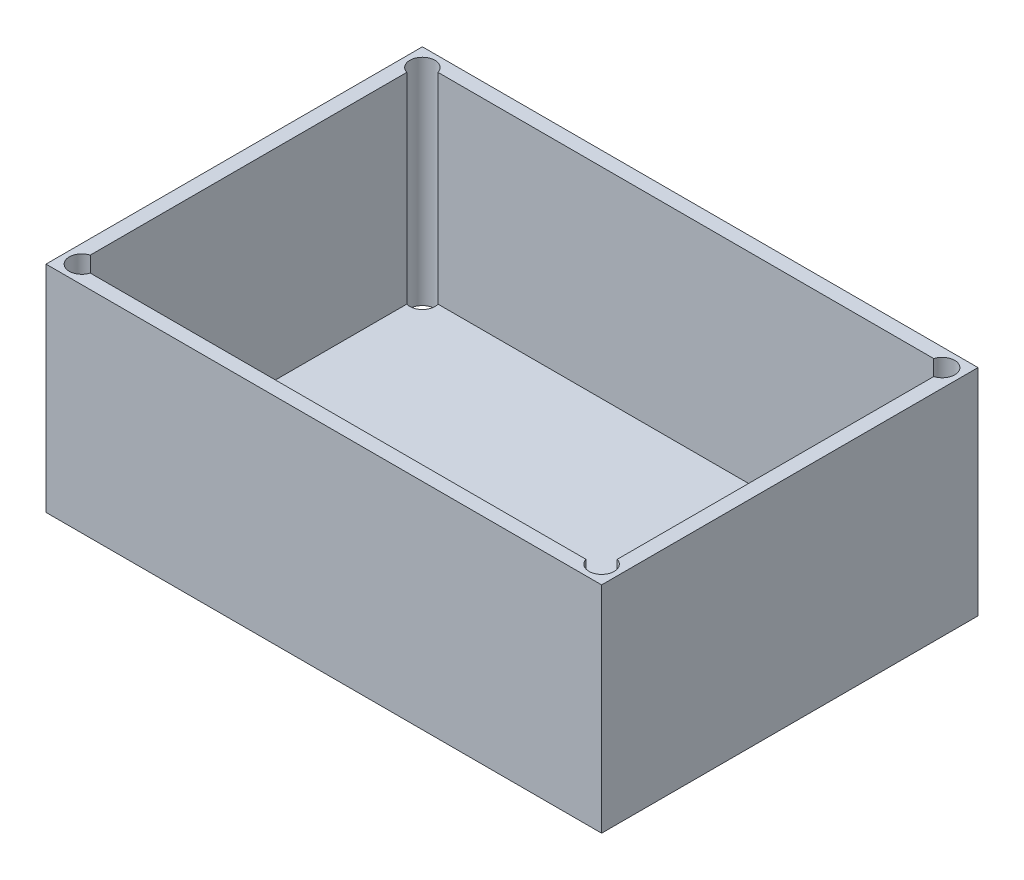
ISO-10303-21;
HEADER;
FILE_DESCRIPTION(('STEP AP214'),'2;1');
FILE_NAME('part.step','',(''),(''),'','','');
FILE_SCHEMA(('AUTOMOTIVE_DESIGN { 1 0 10303 214 1 1 1 1 }'));
ENDSEC;
DATA;
#1=APPLICATION_CONTEXT('core data for automotive mechanical design processes');
#2=APPLICATION_PROTOCOL_DEFINITION('international standard','automotive_design',2000,#1);
#3=PRODUCT_CONTEXT('',#1,'mechanical');
#4=PRODUCT('Part','Part','',(#3));
#5=PRODUCT_RELATED_PRODUCT_CATEGORY('part','',(#4));
#6=PRODUCT_DEFINITION_FORMATION('','',#4);
#7=PRODUCT_DEFINITION_CONTEXT('part definition',#1,'design');
#8=PRODUCT_DEFINITION('design','',#6,#7);
#9=PRODUCT_DEFINITION_SHAPE('','',#8);
#10=(LENGTH_UNIT() NAMED_UNIT(*) SI_UNIT(.MILLI.,.METRE.));
#11=(NAMED_UNIT(*) PLANE_ANGLE_UNIT() SI_UNIT($,.RADIAN.));
#12=(NAMED_UNIT(*) SI_UNIT($,.STERADIAN.) SOLID_ANGLE_UNIT());
#13=UNCERTAINTY_MEASURE_WITH_UNIT(LENGTH_MEASURE(1.E-05),#10,'distance_accuracy_value','');
#14=(GEOMETRIC_REPRESENTATION_CONTEXT(3) GLOBAL_UNCERTAINTY_ASSIGNED_CONTEXT((#13)) GLOBAL_UNIT_ASSIGNED_CONTEXT((#10,
#11,#12)) REPRESENTATION_CONTEXT('',''));
#15=CARTESIAN_POINT('',(0.,0.,0.));
#16=DIRECTION('',(0.,0.,1.));
#17=DIRECTION('',(1.,0.,0.));
#18=AXIS2_PLACEMENT_3D('',#15,#16,#17);
#19=CARTESIAN_POINT('',(-38.75,30.,26.25));
#20=DIRECTION('',(1.,0.,0.));
#21=DIRECTION('',(0.,0.,-1.));
#22=AXIS2_PLACEMENT_3D('',#19,#20,#21);
#23=PLANE('',#22);
#24=DIRECTION('',(0.,0.,1.));
#25=VECTOR('',#24,1.);
#26=CARTESIAN_POINT('',(-38.75,0.,26.25));
#27=LINE('',#26,#25);
#28=CARTESIAN_POINT('',(-38.75,0.,-26.25));
#29=VERTEX_POINT('',#28);
#30=CARTESIAN_POINT('',(-38.75,0.,26.25));
#31=VERTEX_POINT('',#30);
#32=EDGE_CURVE('E184',#29,#31,#27,.T.);
#33=ORIENTED_EDGE('',*,*,#32,.T.);
#34=DIRECTION('',(0.,-1.,0.));
#35=VECTOR('',#34,1.);
#36=CARTESIAN_POINT('',(-38.75,30.,26.25));
#37=LINE('',#36,#35);
#38=CARTESIAN_POINT('',(-38.75,30.,26.25));
#39=VERTEX_POINT('',#38);
#40=EDGE_CURVE('E146',#39,#31,#37,.T.);
#41=ORIENTED_EDGE('',*,*,#40,.F.);
#42=DIRECTION('',(0.,0.,1.));
#43=VECTOR('',#42,1.);
#44=CARTESIAN_POINT('',(-38.75,30.,26.25));
#45=LINE('',#44,#43);
#46=CARTESIAN_POINT('',(-38.75,30.,-26.25));
#47=VERTEX_POINT('',#46);
#48=EDGE_CURVE('E183',#47,#39,#45,.T.);
#49=ORIENTED_EDGE('',*,*,#48,.F.);
#50=DIRECTION('',(0.,-1.,0.));
#51=VECTOR('',#50,1.);
#52=CARTESIAN_POINT('',(-38.75,30.,-26.25));
#53=LINE('',#52,#51);
#54=EDGE_CURVE('E200',#47,#29,#53,.T.);
#55=ORIENTED_EDGE('',*,*,#54,.T.);
#56=EDGE_LOOP('',(#33,#41,#49,#55));
#57=FACE_BOUND('',#56,.T.);
#58=ADVANCED_FACE('F50',(#57),#23,.F.);
#59=CARTESIAN_POINT('',(38.75,30.,26.25));
#60=DIRECTION('',(0.,0.,-1.));
#61=DIRECTION('',(-1.,0.,0.));
#62=AXIS2_PLACEMENT_3D('',#59,#60,#61);
#63=PLANE('',#62);
#64=DIRECTION('',(1.,0.,0.));
#65=VECTOR('',#64,1.);
#66=CARTESIAN_POINT('',(38.75,0.,26.25));
#67=LINE('',#66,#65);
#68=CARTESIAN_POINT('',(38.75,0.,26.25));
#69=VERTEX_POINT('',#68);
#70=EDGE_CURVE('E201',#31,#69,#67,.T.);
#71=ORIENTED_EDGE('',*,*,#70,.T.);
#72=DIRECTION('',(0.,-1.,0.));
#73=VECTOR('',#72,1.);
#74=CARTESIAN_POINT('',(38.75,30.,26.25));
#75=LINE('',#74,#73);
#76=CARTESIAN_POINT('',(38.75,30.,26.25));
#77=VERTEX_POINT('',#76);
#78=EDGE_CURVE('E217',#77,#69,#75,.T.);
#79=ORIENTED_EDGE('',*,*,#78,.F.);
#80=DIRECTION('',(1.,0.,0.));
#81=VECTOR('',#80,1.);
#82=CARTESIAN_POINT('',(38.75,30.,26.25));
#83=LINE('',#82,#81);
#84=EDGE_CURVE('E188',#39,#77,#83,.T.);
#85=ORIENTED_EDGE('',*,*,#84,.F.);
#86=ORIENTED_EDGE('',*,*,#40,.T.);
#87=EDGE_LOOP('',(#71,#79,#85,#86));
#88=FACE_BOUND('',#87,.T.);
#89=ADVANCED_FACE('F328',(#88),#63,.F.);
#90=CARTESIAN_POINT('',(38.75,30.,26.25));
#91=DIRECTION('',(-1.,0.,0.));
#92=DIRECTION('',(0.,0.,1.));
#93=AXIS2_PLACEMENT_3D('',#90,#91,#92);
#94=PLANE('',#93);
#95=DIRECTION('',(0.,0.,-1.));
#96=VECTOR('',#95,1.);
#97=CARTESIAN_POINT('',(38.75,0.,26.25));
#98=LINE('',#97,#96);
#99=CARTESIAN_POINT('',(38.75,0.,-26.25));
#100=VERTEX_POINT('',#99);
#101=EDGE_CURVE('E206',#69,#100,#98,.T.);
#102=ORIENTED_EDGE('',*,*,#101,.T.);
#103=DIRECTION('',(0.,-1.,0.));
#104=VECTOR('',#103,1.);
#105=CARTESIAN_POINT('',(38.75,30.,-26.25));
#106=LINE('',#105,#104);
#107=CARTESIAN_POINT('',(38.75,30.,-26.25));
#108=VERTEX_POINT('',#107);
#109=EDGE_CURVE('E212',#108,#100,#106,.T.);
#110=ORIENTED_EDGE('',*,*,#109,.F.);
#111=DIRECTION('',(0.,0.,-1.));
#112=VECTOR('',#111,1.);
#113=CARTESIAN_POINT('',(38.75,30.,26.25));
#114=LINE('',#113,#112);
#115=EDGE_CURVE('E193',#77,#108,#114,.T.);
#116=ORIENTED_EDGE('',*,*,#115,.F.);
#117=ORIENTED_EDGE('',*,*,#78,.T.);
#118=EDGE_LOOP('',(#102,#110,#116,#117));
#119=FACE_BOUND('',#118,.T.);
#120=ADVANCED_FACE('F326',(#119),#94,.F.);
#121=CARTESIAN_POINT('',(38.75,30.,-26.25));
#122=DIRECTION('',(0.,0.,1.));
#123=DIRECTION('',(1.,0.,0.));
#124=AXIS2_PLACEMENT_3D('',#121,#122,#123);
#125=PLANE('',#124);
#126=DIRECTION('',(-1.,0.,0.));
#127=VECTOR('',#126,1.);
#128=CARTESIAN_POINT('',(38.75,0.,-26.25));
#129=LINE('',#128,#127);
#130=EDGE_CURVE('E189',#100,#29,#129,.T.);
#131=ORIENTED_EDGE('',*,*,#130,.T.);
#132=ORIENTED_EDGE('',*,*,#54,.F.);
#133=DIRECTION('',(-1.,0.,0.));
#134=VECTOR('',#133,1.);
#135=CARTESIAN_POINT('',(38.75,30.,-26.25));
#136=LINE('',#135,#134);
#137=EDGE_CURVE('E198',#108,#47,#136,.T.);
#138=ORIENTED_EDGE('',*,*,#137,.F.);
#139=ORIENTED_EDGE('',*,*,#109,.T.);
#140=EDGE_LOOP('',(#131,#132,#138,#139));
#141=FACE_BOUND('',#140,.T.);
#142=ADVANCED_FACE('F325',(#141),#125,.F.);
#143=CARTESIAN_POINT('',(0.,30.,0.));
#144=DIRECTION('',(0.,1.,0.));
#145=DIRECTION('',(0.,0.,1.));
#146=AXIS2_PLACEMENT_3D('',#143,#144,#145);
#147=PLANE('',#146);
#148=CARTESIAN_POINT('',(-36.25,30.,23.75));
#149=DIRECTION('',(0.,1.,0.));
#150=DIRECTION('',(0.,0.,1.));
#151=AXIS2_PLACEMENT_3D('',#148,#149,#150);
#152=CIRCLE('',#151,1.75);
#153=CARTESIAN_POINT('',(-36.75,30.,22.0729490168752));
#154=VERTEX_POINT('',#153);
#155=CARTESIAN_POINT('',(-34.5729490168751,30.,24.25));
#156=VERTEX_POINT('',#155);
#157=EDGE_CURVE('E253',#154,#156,#152,.T.);
#158=ORIENTED_EDGE('',*,*,#157,.F.);
#159=DIRECTION('',(0.,0.,1.));
#160=VECTOR('',#159,1.);
#161=CARTESIAN_POINT('',(-36.75,30.,26.25));
#162=LINE('',#161,#160);
#163=CARTESIAN_POINT('',(-36.75,30.,-22.0729490168752));
#164=VERTEX_POINT('',#163);
#165=EDGE_CURVE('E162',#164,#154,#162,.T.);
#166=ORIENTED_EDGE('',*,*,#165,.F.);
#167=CARTESIAN_POINT('',(-36.25,30.,-23.75));
#168=DIRECTION('',(0.,1.,0.));
#169=DIRECTION('',(0.,0.,1.));
#170=AXIS2_PLACEMENT_3D('',#167,#168,#169);
#171=CIRCLE('',#170,1.75);
#172=CARTESIAN_POINT('',(-34.5729490168751,30.,-24.25));
#173=VERTEX_POINT('',#172);
#174=EDGE_CURVE('E283',#173,#164,#171,.T.);
#175=ORIENTED_EDGE('',*,*,#174,.F.);
#176=DIRECTION('',(-1.,0.,0.));
#177=VECTOR('',#176,1.);
#178=CARTESIAN_POINT('',(38.75,30.,-24.25));
#179=LINE('',#178,#177);
#180=CARTESIAN_POINT('',(34.5729490168751,30.,-24.25));
#181=VERTEX_POINT('',#180);
#182=EDGE_CURVE('E156',#181,#173,#179,.T.);
#183=ORIENTED_EDGE('',*,*,#182,.F.);
#184=CARTESIAN_POINT('',(36.25,30.,-23.75));
#185=DIRECTION('',(0.,1.,0.));
#186=DIRECTION('',(0.,0.,1.));
#187=AXIS2_PLACEMENT_3D('',#184,#185,#186);
#188=CIRCLE('',#187,1.75);
#189=CARTESIAN_POINT('',(36.75,30.,-22.0729490168752));
#190=VERTEX_POINT('',#189);
#191=EDGE_CURVE('E275',#190,#181,#188,.T.);
#192=ORIENTED_EDGE('',*,*,#191,.F.);
#193=DIRECTION('',(0.,0.,-1.));
#194=VECTOR('',#193,1.);
#195=CARTESIAN_POINT('',(36.75,30.,26.25));
#196=LINE('',#195,#194);
#197=CARTESIAN_POINT('',(36.75,30.,22.0729490168751));
#198=VERTEX_POINT('',#197);
#199=EDGE_CURVE('E178',#198,#190,#196,.T.);
#200=ORIENTED_EDGE('',*,*,#199,.F.);
#201=CARTESIAN_POINT('',(36.25,30.,23.75));
#202=DIRECTION('',(0.,1.,0.));
#203=DIRECTION('',(0.,0.,1.));
#204=AXIS2_PLACEMENT_3D('',#201,#202,#203);
#205=CIRCLE('',#204,1.75);
#206=CARTESIAN_POINT('',(34.5729490168751,30.,24.25));
#207=VERTEX_POINT('',#206);
#208=EDGE_CURVE('E238',#207,#198,#205,.T.);
#209=ORIENTED_EDGE('',*,*,#208,.F.);
#210=DIRECTION('',(1.,0.,0.));
#211=VECTOR('',#210,1.);
#212=CARTESIAN_POINT('',(38.75,30.,24.25));
#213=LINE('',#212,#211);
#214=EDGE_CURVE('E166',#156,#207,#213,.T.);
#215=ORIENTED_EDGE('',*,*,#214,.F.);
#216=EDGE_LOOP('',(#158,#166,#175,#183,#192,#200,#209,#215));
#217=FACE_BOUND('',#216,.T.);
#218=ORIENTED_EDGE('',*,*,#48,.T.);
#219=ORIENTED_EDGE('',*,*,#84,.T.);
#220=ORIENTED_EDGE('',*,*,#115,.T.);
#221=ORIENTED_EDGE('',*,*,#137,.T.);
#222=EDGE_LOOP('',(#218,#219,#220,#221));
#223=FACE_BOUND('',#222,.T.);
#224=ADVANCED_FACE('F294',(#217,#223),#147,.T.);
#225=CARTESIAN_POINT('',(0.,0.,0.));
#226=DIRECTION('',(0.,1.,0.));
#227=DIRECTION('',(0.,0.,1.));
#228=AXIS2_PLACEMENT_3D('',#225,#226,#227);
#229=PLANE('',#228);
#230=CARTESIAN_POINT('',(-36.25,0.,23.75));
#231=DIRECTION('',(0.,1.,0.));
#232=DIRECTION('',(0.,0.,1.));
#233=AXIS2_PLACEMENT_3D('',#230,#231,#232);
#234=CIRCLE('',#233,1.75);
#235=CARTESIAN_POINT('',(-36.25,0.,25.5));
#236=VERTEX_POINT('',#235);
#237=EDGE_CURVE('E244',#236,#236,#234,.T.);
#238=ORIENTED_EDGE('',*,*,#237,.T.);
#239=EDGE_LOOP('',(#238));
#240=FACE_BOUND('',#239,.T.);
#241=CARTESIAN_POINT('',(36.25,0.,23.75));
#242=DIRECTION('',(0.,1.,0.));
#243=DIRECTION('',(0.,0.,1.));
#244=AXIS2_PLACEMENT_3D('',#241,#242,#243);
#245=CIRCLE('',#244,1.75);
#246=CARTESIAN_POINT('',(36.25,0.,25.5));
#247=VERTEX_POINT('',#246);
#248=EDGE_CURVE('E257',#247,#247,#245,.T.);
#249=ORIENTED_EDGE('',*,*,#248,.T.);
#250=EDGE_LOOP('',(#249));
#251=FACE_BOUND('',#250,.T.);
#252=CARTESIAN_POINT('',(36.25,0.,-23.75));
#253=DIRECTION('',(0.,1.,0.));
#254=DIRECTION('',(0.,0.,1.));
#255=AXIS2_PLACEMENT_3D('',#252,#253,#254);
#256=CIRCLE('',#255,1.75);
#257=CARTESIAN_POINT('',(36.25,0.,-22.));
#258=VERTEX_POINT('',#257);
#259=EDGE_CURVE('E268',#258,#258,#256,.T.);
#260=ORIENTED_EDGE('',*,*,#259,.T.);
#261=EDGE_LOOP('',(#260));
#262=FACE_BOUND('',#261,.T.);
#263=CARTESIAN_POINT('',(-36.25,0.,-23.75));
#264=DIRECTION('',(0.,1.,0.));
#265=DIRECTION('',(0.,0.,1.));
#266=AXIS2_PLACEMENT_3D('',#263,#264,#265);
#267=CIRCLE('',#266,1.75);
#268=CARTESIAN_POINT('',(-36.25,0.,-22.));
#269=VERTEX_POINT('',#268);
#270=EDGE_CURVE('E278',#269,#269,#267,.T.);
#271=ORIENTED_EDGE('',*,*,#270,.T.);
#272=EDGE_LOOP('',(#271));
#273=FACE_BOUND('',#272,.T.);
#274=ORIENTED_EDGE('',*,*,#32,.F.);
#275=ORIENTED_EDGE('',*,*,#130,.F.);
#276=ORIENTED_EDGE('',*,*,#101,.F.);
#277=ORIENTED_EDGE('',*,*,#70,.F.);
#278=EDGE_LOOP('',(#274,#275,#276,#277));
#279=FACE_BOUND('',#278,.T.);
#280=ADVANCED_FACE('F303',(#240,#251,#262,#273,#279),#229,.F.);
#281=CARTESIAN_POINT('',(-36.75,30.,26.25));
#282=DIRECTION('',(1.,0.,0.));
#283=DIRECTION('',(0.,0.,-1.));
#284=AXIS2_PLACEMENT_3D('',#281,#282,#283);
#285=PLANE('',#284);
#286=DIRECTION('',(0.,1.,0.));
#287=VECTOR('',#286,1.);
#288=CARTESIAN_POINT('',(-36.75,-28.,22.0729490168752));
#289=LINE('',#288,#287);
#290=CARTESIAN_POINT('',(-36.75,2.,22.0729490168752));
#291=VERTEX_POINT('',#290);
#292=EDGE_CURVE('E255',#291,#154,#289,.T.);
#293=ORIENTED_EDGE('',*,*,#292,.F.);
#294=DIRECTION('',(0.,0.,1.));
#295=VECTOR('',#294,1.);
#296=CARTESIAN_POINT('',(-36.75,2.,26.25));
#297=LINE('',#296,#295);
#298=CARTESIAN_POINT('',(-36.75,2.,-22.0729490168752));
#299=VERTEX_POINT('',#298);
#300=EDGE_CURVE('E242',#299,#291,#297,.T.);
#301=ORIENTED_EDGE('',*,*,#300,.F.);
#302=DIRECTION('',(0.,1.,0.));
#303=VECTOR('',#302,1.);
#304=CARTESIAN_POINT('',(-36.75,-28.,-22.0729490168752));
#305=LINE('',#304,#303);
#306=EDGE_CURVE('E143',#164,#299,#305,.F.);
#307=ORIENTED_EDGE('',*,*,#306,.F.);
#308=ORIENTED_EDGE('',*,*,#165,.T.);
#309=EDGE_LOOP('',(#293,#301,#307,#308));
#310=FACE_BOUND('',#309,.T.);
#311=ADVANCED_FACE('F295',(#310),#285,.T.);
#312=CARTESIAN_POINT('',(38.75,30.,24.25));
#313=DIRECTION('',(0.,0.,-1.));
#314=DIRECTION('',(-1.,0.,0.));
#315=AXIS2_PLACEMENT_3D('',#312,#313,#314);
#316=PLANE('',#315);
#317=DIRECTION('',(0.,1.,0.));
#318=VECTOR('',#317,1.);
#319=CARTESIAN_POINT('',(-34.5729490168751,-28.,24.25));
#320=LINE('',#319,#318);
#321=CARTESIAN_POINT('',(-34.5729490168751,2.,24.25));
#322=VERTEX_POINT('',#321);
#323=EDGE_CURVE('E260',#156,#322,#320,.F.);
#324=ORIENTED_EDGE('',*,*,#323,.F.);
#325=ORIENTED_EDGE('',*,*,#214,.T.);
#326=DIRECTION('',(0.,1.,0.));
#327=VECTOR('',#326,1.);
#328=CARTESIAN_POINT('',(34.5729490168751,-28.,24.25));
#329=LINE('',#328,#327);
#330=CARTESIAN_POINT('',(34.5729490168751,2.,24.25));
#331=VERTEX_POINT('',#330);
#332=EDGE_CURVE('E229',#331,#207,#329,.T.);
#333=ORIENTED_EDGE('',*,*,#332,.F.);
#334=DIRECTION('',(1.,0.,0.));
#335=VECTOR('',#334,1.);
#336=CARTESIAN_POINT('',(38.75,2.,24.25));
#337=LINE('',#336,#335);
#338=EDGE_CURVE('E171',#322,#331,#337,.T.);
#339=ORIENTED_EDGE('',*,*,#338,.F.);
#340=EDGE_LOOP('',(#324,#325,#333,#339));
#341=FACE_BOUND('',#340,.T.);
#342=ADVANCED_FACE('F240',(#341),#316,.T.);
#343=CARTESIAN_POINT('',(36.75,30.,26.25));
#344=DIRECTION('',(-1.,0.,0.));
#345=DIRECTION('',(0.,0.,1.));
#346=AXIS2_PLACEMENT_3D('',#343,#344,#345);
#347=PLANE('',#346);
#348=DIRECTION('',(0.,1.,0.));
#349=VECTOR('',#348,1.);
#350=CARTESIAN_POINT('',(36.75,-28.,22.0729490168751));
#351=LINE('',#350,#349);
#352=CARTESIAN_POINT('',(36.75,2.,22.0729490168751));
#353=VERTEX_POINT('',#352);
#354=EDGE_CURVE('E66',#198,#353,#351,.F.);
#355=ORIENTED_EDGE('',*,*,#354,.F.);
#356=ORIENTED_EDGE('',*,*,#199,.T.);
#357=DIRECTION('',(0.,1.,0.));
#358=VECTOR('',#357,1.);
#359=CARTESIAN_POINT('',(36.75,-28.,-22.0729490168752));
#360=LINE('',#359,#358);
#361=CARTESIAN_POINT('',(36.75,2.,-22.0729490168752));
#362=VERTEX_POINT('',#361);
#363=EDGE_CURVE('E274',#362,#190,#360,.T.);
#364=ORIENTED_EDGE('',*,*,#363,.F.);
#365=DIRECTION('',(0.,0.,-1.));
#366=VECTOR('',#365,1.);
#367=CARTESIAN_POINT('',(36.75,2.,26.25));
#368=LINE('',#367,#366);
#369=EDGE_CURVE('E163',#353,#362,#368,.T.);
#370=ORIENTED_EDGE('',*,*,#369,.F.);
#371=EDGE_LOOP('',(#355,#356,#364,#370));
#372=FACE_BOUND('',#371,.T.);
#373=ADVANCED_FACE('F379',(#372),#347,.T.);
#374=CARTESIAN_POINT('',(38.75,30.,-24.25));
#375=DIRECTION('',(0.,0.,1.));
#376=DIRECTION('',(1.,0.,0.));
#377=AXIS2_PLACEMENT_3D('',#374,#375,#376);
#378=PLANE('',#377);
#379=DIRECTION('',(0.,1.,0.));
#380=VECTOR('',#379,1.);
#381=CARTESIAN_POINT('',(34.5729490168751,-28.,-24.25));
#382=LINE('',#381,#380);
#383=CARTESIAN_POINT('',(34.5729490168751,2.,-24.25));
#384=VERTEX_POINT('',#383);
#385=EDGE_CURVE('E65',#181,#384,#382,.F.);
#386=ORIENTED_EDGE('',*,*,#385,.F.);
#387=ORIENTED_EDGE('',*,*,#182,.T.);
#388=DIRECTION('',(0.,1.,0.));
#389=VECTOR('',#388,1.);
#390=CARTESIAN_POINT('',(-34.5729490168751,-28.,-24.25));
#391=LINE('',#390,#389);
#392=CARTESIAN_POINT('',(-34.5729490168751,2.,-24.25));
#393=VERTEX_POINT('',#392);
#394=EDGE_CURVE('E138',#393,#173,#391,.T.);
#395=ORIENTED_EDGE('',*,*,#394,.F.);
#396=DIRECTION('',(-1.,0.,0.));
#397=VECTOR('',#396,1.);
#398=CARTESIAN_POINT('',(38.75,2.,-24.25));
#399=LINE('',#398,#397);
#400=EDGE_CURVE('E152',#384,#393,#399,.T.);
#401=ORIENTED_EDGE('',*,*,#400,.F.);
#402=EDGE_LOOP('',(#386,#387,#395,#401));
#403=FACE_BOUND('',#402,.T.);
#404=ADVANCED_FACE('F153',(#403),#378,.T.);
#405=CARTESIAN_POINT('',(0.,2.,0.));
#406=DIRECTION('',(0.,1.,0.));
#407=DIRECTION('',(0.,0.,1.));
#408=AXIS2_PLACEMENT_3D('',#405,#406,#407);
#409=PLANE('',#408);
#410=CARTESIAN_POINT('',(-36.25,2.,23.75));
#411=DIRECTION('',(0.,1.,0.));
#412=DIRECTION('',(0.,0.,1.));
#413=AXIS2_PLACEMENT_3D('',#410,#411,#412);
#414=CIRCLE('',#413,1.75);
#415=EDGE_CURVE('E11',#322,#291,#414,.T.);
#416=ORIENTED_EDGE('',*,*,#415,.F.);
#417=ORIENTED_EDGE('',*,*,#338,.T.);
#418=CARTESIAN_POINT('',(36.25,2.,23.75));
#419=DIRECTION('',(0.,1.,0.));
#420=DIRECTION('',(0.,0.,1.));
#421=AXIS2_PLACEMENT_3D('',#418,#419,#420);
#422=CIRCLE('',#421,1.75);
#423=EDGE_CURVE('E54',#353,#331,#422,.T.);
#424=ORIENTED_EDGE('',*,*,#423,.F.);
#425=ORIENTED_EDGE('',*,*,#369,.T.);
#426=CARTESIAN_POINT('',(36.25,2.,-23.75));
#427=DIRECTION('',(0.,1.,0.));
#428=DIRECTION('',(0.,0.,1.));
#429=AXIS2_PLACEMENT_3D('',#426,#427,#428);
#430=CIRCLE('',#429,1.75);
#431=EDGE_CURVE('E150',#384,#362,#430,.T.);
#432=ORIENTED_EDGE('',*,*,#431,.F.);
#433=ORIENTED_EDGE('',*,*,#400,.T.);
#434=CARTESIAN_POINT('',(-36.25,2.,-23.75));
#435=DIRECTION('',(0.,1.,0.));
#436=DIRECTION('',(0.,0.,1.));
#437=AXIS2_PLACEMENT_3D('',#434,#435,#436);
#438=CIRCLE('',#437,1.75);
#439=EDGE_CURVE('E133',#299,#393,#438,.T.);
#440=ORIENTED_EDGE('',*,*,#439,.F.);
#441=ORIENTED_EDGE('',*,*,#300,.T.);
#442=EDGE_LOOP('',(#416,#417,#424,#425,#432,#433,#440,#441));
#443=FACE_BOUND('',#442,.T.);
#444=ADVANCED_FACE('F159',(#443),#409,.T.);
#445=CARTESIAN_POINT('',(-36.25,-28.,-23.75));
#446=DIRECTION('',(0.,1.,0.));
#447=DIRECTION('',(0.,0.,1.));
#448=AXIS2_PLACEMENT_3D('',#445,#446,#447);
#449=CYLINDRICAL_SURFACE('',#448,1.75);
#450=ORIENTED_EDGE('',*,*,#174,.T.);
#451=ORIENTED_EDGE('',*,*,#306,.T.);
#452=ORIENTED_EDGE('',*,*,#439,.T.);
#453=ORIENTED_EDGE('',*,*,#394,.T.);
#454=EDGE_LOOP('',(#450,#451,#452,#453));
#455=FACE_BOUND('',#454,.T.);
#456=ORIENTED_EDGE('',*,*,#270,.F.);
#457=EDGE_LOOP('',(#456));
#458=FACE_BOUND('',#457,.T.);
#459=ADVANCED_FACE('F137',(#455,#458),#449,.F.);
#460=CARTESIAN_POINT('',(36.25,-28.,-23.75));
#461=DIRECTION('',(0.,1.,0.));
#462=DIRECTION('',(0.,0.,1.));
#463=AXIS2_PLACEMENT_3D('',#460,#461,#462);
#464=CYLINDRICAL_SURFACE('',#463,1.75);
#465=ORIENTED_EDGE('',*,*,#191,.T.);
#466=ORIENTED_EDGE('',*,*,#385,.T.);
#467=ORIENTED_EDGE('',*,*,#431,.T.);
#468=ORIENTED_EDGE('',*,*,#363,.T.);
#469=EDGE_LOOP('',(#465,#466,#467,#468));
#470=FACE_BOUND('',#469,.T.);
#471=ORIENTED_EDGE('',*,*,#259,.F.);
#472=EDGE_LOOP('',(#471));
#473=FACE_BOUND('',#472,.T.);
#474=ADVANCED_FACE('F413',(#470,#473),#464,.F.);
#475=CARTESIAN_POINT('',(36.25,-28.,23.75));
#476=DIRECTION('',(0.,1.,0.));
#477=DIRECTION('',(0.,0.,1.));
#478=AXIS2_PLACEMENT_3D('',#475,#476,#477);
#479=CYLINDRICAL_SURFACE('',#478,1.75);
#480=ORIENTED_EDGE('',*,*,#208,.T.);
#481=ORIENTED_EDGE('',*,*,#354,.T.);
#482=ORIENTED_EDGE('',*,*,#423,.T.);
#483=ORIENTED_EDGE('',*,*,#332,.T.);
#484=EDGE_LOOP('',(#480,#481,#482,#483));
#485=FACE_BOUND('',#484,.T.);
#486=ORIENTED_EDGE('',*,*,#248,.F.);
#487=EDGE_LOOP('',(#486));
#488=FACE_BOUND('',#487,.T.);
#489=ADVANCED_FACE('F227',(#485,#488),#479,.F.);
#490=CARTESIAN_POINT('',(-36.25,-28.,23.75));
#491=DIRECTION('',(0.,1.,0.));
#492=DIRECTION('',(0.,0.,1.));
#493=AXIS2_PLACEMENT_3D('',#490,#491,#492);
#494=CYLINDRICAL_SURFACE('',#493,1.75);
#495=ORIENTED_EDGE('',*,*,#157,.T.);
#496=ORIENTED_EDGE('',*,*,#323,.T.);
#497=ORIENTED_EDGE('',*,*,#415,.T.);
#498=ORIENTED_EDGE('',*,*,#292,.T.);
#499=EDGE_LOOP('',(#495,#496,#497,#498));
#500=FACE_BOUND('',#499,.T.);
#501=ORIENTED_EDGE('',*,*,#237,.F.);
#502=EDGE_LOOP('',(#501));
#503=FACE_BOUND('',#502,.T.);
#504=ADVANCED_FACE('F300',(#500,#503),#494,.F.);
#505=CLOSED_SHELL('',(#58,#89,#120,#142,#224,#280,#311,#342,#373,#404,#444,#459,#474,#489,#504));
#506=MANIFOLD_SOLID_BREP('B2',#505);
#507=ADVANCED_BREP_SHAPE_REPRESENTATION('',(#18,#506),#14);
#508=SHAPE_DEFINITION_REPRESENTATION(#9,#507);
ENDSEC;
END-ISO-10303-21;
